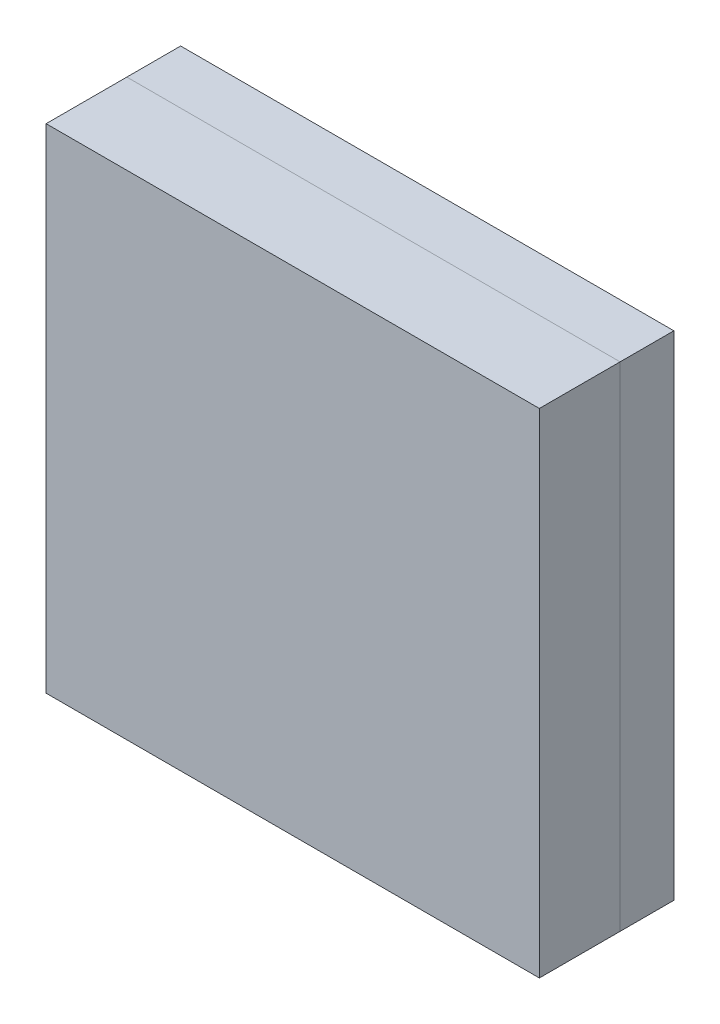
ISO-10303-21;
HEADER;
FILE_DESCRIPTION(('STEP AP214'),'2;1');
FILE_NAME('part.step','',(''),(''),'','','');
FILE_SCHEMA(('AUTOMOTIVE_DESIGN { 1 0 10303 214 1 1 1 1 }'));
ENDSEC;
DATA;
#1=APPLICATION_CONTEXT('core data for automotive mechanical design processes');
#2=APPLICATION_PROTOCOL_DEFINITION('international standard','automotive_design',2000,#1);
#3=PRODUCT_CONTEXT('',#1,'mechanical');
#4=PRODUCT('Part','Part','',(#3));
#5=PRODUCT_RELATED_PRODUCT_CATEGORY('part','',(#4));
#6=PRODUCT_DEFINITION_FORMATION('','',#4);
#7=PRODUCT_DEFINITION_CONTEXT('part definition',#1,'design');
#8=PRODUCT_DEFINITION('design','',#6,#7);
#9=PRODUCT_DEFINITION_SHAPE('','',#8);
#10=(LENGTH_UNIT() NAMED_UNIT(*) SI_UNIT(.MILLI.,.METRE.));
#11=(NAMED_UNIT(*) PLANE_ANGLE_UNIT() SI_UNIT($,.RADIAN.));
#12=(NAMED_UNIT(*) SI_UNIT($,.STERADIAN.) SOLID_ANGLE_UNIT());
#13=UNCERTAINTY_MEASURE_WITH_UNIT(LENGTH_MEASURE(1.E-05),#10,'distance_accuracy_value','');
#14=(GEOMETRIC_REPRESENTATION_CONTEXT(3) GLOBAL_UNCERTAINTY_ASSIGNED_CONTEXT((#13)) GLOBAL_UNIT_ASSIGNED_CONTEXT((#10,
#11,#12)) REPRESENTATION_CONTEXT('',''));
#15=CARTESIAN_POINT('',(0.,0.,0.));
#16=DIRECTION('',(0.,0.,1.));
#17=DIRECTION('',(1.,0.,0.));
#18=AXIS2_PLACEMENT_3D('',#15,#16,#17);
#19=CARTESIAN_POINT('',(5.5,5.5,-0.6));
#20=DIRECTION('',(-1.,0.,0.));
#21=DIRECTION('',(0.,0.,1.));
#22=AXIS2_PLACEMENT_3D('',#19,#20,#21);
#23=PLANE('',#22);
#24=DIRECTION('',(0.,-1.,0.));
#25=VECTOR('',#24,1.);
#26=CARTESIAN_POINT('',(5.5,5.5,0.));
#27=LINE('',#26,#25);
#28=CARTESIAN_POINT('',(5.5,5.5,0.));
#29=VERTEX_POINT('',#28);
#30=CARTESIAN_POINT('',(5.5,0.,0.));
#31=VERTEX_POINT('',#30);
#32=EDGE_CURVE('E139',#29,#31,#27,.T.);
#33=ORIENTED_EDGE('',*,*,#32,.T.);
#34=DIRECTION('',(0.,0.,1.));
#35=VECTOR('',#34,1.);
#36=CARTESIAN_POINT('',(5.5,0.,-0.6));
#37=LINE('',#36,#35);
#38=CARTESIAN_POINT('',(5.5,0.,-0.6));
#39=VERTEX_POINT('',#38);
#40=EDGE_CURVE('E13',#39,#31,#37,.T.);
#41=ORIENTED_EDGE('',*,*,#40,.F.);
#42=DIRECTION('',(0.,-1.,0.));
#43=VECTOR('',#42,1.);
#44=CARTESIAN_POINT('',(5.5,5.5,-0.6));
#45=LINE('',#44,#43);
#46=CARTESIAN_POINT('',(5.5,5.5,-0.6));
#47=VERTEX_POINT('',#46);
#48=EDGE_CURVE('E127',#47,#39,#45,.T.);
#49=ORIENTED_EDGE('',*,*,#48,.F.);
#50=DIRECTION('',(0.,0.,1.));
#51=VECTOR('',#50,1.);
#52=CARTESIAN_POINT('',(5.5,5.5,-0.6));
#53=LINE('',#52,#51);
#54=EDGE_CURVE('E135',#47,#29,#53,.T.);
#55=ORIENTED_EDGE('',*,*,#54,.T.);
#56=EDGE_LOOP('',(#33,#41,#49,#55));
#57=FACE_BOUND('',#56,.T.);
#58=ADVANCED_FACE('F76',(#57),#23,.F.);
#59=CARTESIAN_POINT('',(5.5,0.,-0.6));
#60=DIRECTION('',(0.,1.,0.));
#61=DIRECTION('',(0.,0.,1.));
#62=AXIS2_PLACEMENT_3D('',#59,#60,#61);
#63=PLANE('',#62);
#64=DIRECTION('',(-1.,0.,0.));
#65=VECTOR('',#64,1.);
#66=CARTESIAN_POINT('',(5.5,0.,0.));
#67=LINE('',#66,#65);
#68=CARTESIAN_POINT('',(0.,0.,0.));
#69=VERTEX_POINT('',#68);
#70=EDGE_CURVE('E131',#31,#69,#67,.T.);
#71=ORIENTED_EDGE('',*,*,#70,.T.);
#72=DIRECTION('',(0.,0.,1.));
#73=VECTOR('',#72,1.);
#74=CARTESIAN_POINT('',(0.,0.,-0.6));
#75=LINE('',#74,#73);
#76=CARTESIAN_POINT('',(0.,0.,-0.6));
#77=VERTEX_POINT('',#76);
#78=EDGE_CURVE('E84',#77,#69,#75,.T.);
#79=ORIENTED_EDGE('',*,*,#78,.F.);
#80=DIRECTION('',(-1.,0.,0.));
#81=VECTOR('',#80,1.);
#82=CARTESIAN_POINT('',(5.5,0.,-0.6));
#83=LINE('',#82,#81);
#84=EDGE_CURVE('E122',#39,#77,#83,.T.);
#85=ORIENTED_EDGE('',*,*,#84,.F.);
#86=ORIENTED_EDGE('',*,*,#40,.T.);
#87=EDGE_LOOP('',(#71,#79,#85,#86));
#88=FACE_BOUND('',#87,.T.);
#89=ADVANCED_FACE('F130',(#88),#63,.F.);
#90=CARTESIAN_POINT('',(0.,5.5,-0.6));
#91=DIRECTION('',(1.,0.,0.));
#92=DIRECTION('',(0.,0.,-1.));
#93=AXIS2_PLACEMENT_3D('',#90,#91,#92);
#94=PLANE('',#93);
#95=DIRECTION('',(0.,1.,0.));
#96=VECTOR('',#95,1.);
#97=CARTESIAN_POINT('',(0.,5.5,0.));
#98=LINE('',#97,#96);
#99=CARTESIAN_POINT('',(0.,5.5,0.));
#100=VERTEX_POINT('',#99);
#101=EDGE_CURVE('E109',#69,#100,#98,.T.);
#102=ORIENTED_EDGE('',*,*,#101,.T.);
#103=DIRECTION('',(0.,0.,1.));
#104=VECTOR('',#103,1.);
#105=CARTESIAN_POINT('',(0.,5.5,-0.6));
#106=LINE('',#105,#104);
#107=CARTESIAN_POINT('',(0.,5.5,-0.6));
#108=VERTEX_POINT('',#107);
#109=EDGE_CURVE('E132',#108,#100,#106,.T.);
#110=ORIENTED_EDGE('',*,*,#109,.F.);
#111=DIRECTION('',(0.,1.,0.));
#112=VECTOR('',#111,1.);
#113=CARTESIAN_POINT('',(0.,5.5,-0.6));
#114=LINE('',#113,#112);
#115=EDGE_CURVE('E125',#77,#108,#114,.T.);
#116=ORIENTED_EDGE('',*,*,#115,.F.);
#117=ORIENTED_EDGE('',*,*,#78,.T.);
#118=EDGE_LOOP('',(#102,#110,#116,#117));
#119=FACE_BOUND('',#118,.T.);
#120=ADVANCED_FACE('F133',(#119),#94,.F.);
#121=CARTESIAN_POINT('',(5.5,5.5,-0.6));
#122=DIRECTION('',(0.,-1.,0.));
#123=DIRECTION('',(0.,0.,-1.));
#124=AXIS2_PLACEMENT_3D('',#121,#122,#123);
#125=PLANE('',#124);
#126=DIRECTION('',(1.,0.,0.));
#127=VECTOR('',#126,1.);
#128=CARTESIAN_POINT('',(5.5,5.5,0.));
#129=LINE('',#128,#127);
#130=EDGE_CURVE('E115',#100,#29,#129,.T.);
#131=ORIENTED_EDGE('',*,*,#130,.T.);
#132=ORIENTED_EDGE('',*,*,#54,.F.);
#133=DIRECTION('',(1.,0.,0.));
#134=VECTOR('',#133,1.);
#135=CARTESIAN_POINT('',(5.5,5.5,-0.6));
#136=LINE('',#135,#134);
#137=EDGE_CURVE('E92',#108,#47,#136,.T.);
#138=ORIENTED_EDGE('',*,*,#137,.F.);
#139=ORIENTED_EDGE('',*,*,#109,.T.);
#140=EDGE_LOOP('',(#131,#132,#138,#139));
#141=FACE_BOUND('',#140,.T.);
#142=ADVANCED_FACE('F146',(#141),#125,.F.);
#143=CARTESIAN_POINT('',(0.,0.,-0.6));
#144=DIRECTION('',(0.,0.,-1.));
#145=DIRECTION('',(-1.,0.,0.));
#146=AXIS2_PLACEMENT_3D('',#143,#144,#145);
#147=PLANE('',#146);
#148=ORIENTED_EDGE('',*,*,#48,.T.);
#149=ORIENTED_EDGE('',*,*,#84,.T.);
#150=ORIENTED_EDGE('',*,*,#115,.T.);
#151=ORIENTED_EDGE('',*,*,#137,.T.);
#152=EDGE_LOOP('',(#148,#149,#150,#151));
#153=FACE_BOUND('',#152,.T.);
#154=ADVANCED_FACE('F123',(#153),#147,.T.);
#155=CARTESIAN_POINT('',(0.,0.,0.));
#156=DIRECTION('',(0.,0.,-1.));
#157=DIRECTION('',(-1.,0.,0.));
#158=AXIS2_PLACEMENT_3D('',#155,#156,#157);
#159=PLANE('',#158);
#160=ORIENTED_EDGE('',*,*,#32,.F.);
#161=ORIENTED_EDGE('',*,*,#130,.F.);
#162=ORIENTED_EDGE('',*,*,#101,.F.);
#163=ORIENTED_EDGE('',*,*,#70,.F.);
#164=EDGE_LOOP('',(#160,#161,#162,#163));
#165=FACE_BOUND('',#164,.T.);
#166=ADVANCED_FACE('F149',(#165),#159,.F.);
#167=CLOSED_SHELL('',(#58,#89,#120,#142,#154,#166));
#168=MANIFOLD_SOLID_BREP('B2',#167);
#169=CARTESIAN_POINT('',(0.499999999999998,5.,0.8));
#170=DIRECTION('',(1.,0.,0.));
#171=DIRECTION('',(0.,1.,0.));
#172=AXIS2_PLACEMENT_3D('',#169,#170,#171);
#173=PLANE('',#172);
#174=DIRECTION('',(0.,0.,-1.));
#175=VECTOR('',#174,1.);
#176=CARTESIAN_POINT('',(0.499999999999998,5.,0.8));
#177=LINE('',#176,#175);
#178=CARTESIAN_POINT('',(0.499999999999998,5.,0.1));
#179=VERTEX_POINT('',#178);
#180=CARTESIAN_POINT('',(0.499999999999998,5.,0.));
#181=VERTEX_POINT('',#180);
#182=EDGE_CURVE('E647',#179,#181,#177,.T.);
#183=ORIENTED_EDGE('',*,*,#182,.F.);
#184=DIRECTION('',(0.,-1.,0.));
#185=VECTOR('',#184,1.);
#186=CARTESIAN_POINT('',(0.499999999999998,5.,0.1));
#187=LINE('',#186,#185);
#188=CARTESIAN_POINT('',(0.499999999999999,3.5,0.1));
#189=VERTEX_POINT('',#188);
#190=EDGE_CURVE('E666',#179,#189,#187,.T.);
#191=ORIENTED_EDGE('',*,*,#190,.T.);
#192=DIRECTION('',(0.,0.,-1.));
#193=VECTOR('',#192,1.);
#194=CARTESIAN_POINT('',(0.499999999999999,3.5,5.44341649025257));
#195=LINE('',#194,#193);
#196=CARTESIAN_POINT('',(0.499999999999998,3.5,0.));
#197=VERTEX_POINT('',#196);
#198=EDGE_CURVE('E584',#189,#197,#195,.T.);
#199=ORIENTED_EDGE('',*,*,#198,.T.);
#200=DIRECTION('',(0.,-1.,0.));
#201=VECTOR('',#200,1.);
#202=CARTESIAN_POINT('',(0.499999999999998,5.,0.));
#203=LINE('',#202,#201);
#204=EDGE_CURVE('E635',#181,#197,#203,.T.);
#205=ORIENTED_EDGE('',*,*,#204,.F.);
#206=EDGE_LOOP('',(#183,#191,#199,#205));
#207=FACE_BOUND('',#206,.T.);
#208=ADVANCED_FACE('F237',(#207),#173,.T.);
#209=CARTESIAN_POINT('',(0.499999999999999,0.5,0.8));
#210=DIRECTION('',(0.,1.,0.));
#211=DIRECTION('',(-1.,0.,0.));
#212=AXIS2_PLACEMENT_3D('',#209,#210,#211);
#213=PLANE('',#212);
#214=DIRECTION('',(0.,0.,-1.));
#215=VECTOR('',#214,1.);
#216=CARTESIAN_POINT('',(0.499999999999999,0.5,0.8));
#217=LINE('',#216,#215);
#218=CARTESIAN_POINT('',(0.499999999999999,0.5,0.100000000000001));
#219=VERTEX_POINT('',#218);
#220=CARTESIAN_POINT('',(0.499999999999999,0.5,0.));
#221=VERTEX_POINT('',#220);
#222=EDGE_CURVE('E502',#219,#221,#217,.T.);
#223=ORIENTED_EDGE('',*,*,#222,.F.);
#224=DIRECTION('',(1.,0.,0.));
#225=VECTOR('',#224,1.);
#226=CARTESIAN_POINT('',(0.,0.499999999999997,0.100000000000001));
#227=LINE('',#226,#225);
#228=CARTESIAN_POINT('',(2.,0.499999999999998,0.100000000000001));
#229=VERTEX_POINT('',#228);
#230=EDGE_CURVE('E491',#219,#229,#227,.T.);
#231=ORIENTED_EDGE('',*,*,#230,.T.);
#232=DIRECTION('',(0.,0.,-1.));
#233=VECTOR('',#232,1.);
#234=CARTESIAN_POINT('',(2.,0.5,5.44341649025257));
#235=LINE('',#234,#233);
#236=CARTESIAN_POINT('',(2.,0.5,0.));
#237=VERTEX_POINT('',#236);
#238=EDGE_CURVE('E553',#229,#237,#235,.T.);
#239=ORIENTED_EDGE('',*,*,#238,.T.);
#240=DIRECTION('',(1.,0.,0.));
#241=VECTOR('',#240,1.);
#242=CARTESIAN_POINT('',(0.499999999999999,0.5,0.));
#243=LINE('',#242,#241);
#244=EDGE_CURVE('E639',#221,#237,#243,.T.);
#245=ORIENTED_EDGE('',*,*,#244,.F.);
#246=EDGE_LOOP('',(#223,#231,#239,#245));
#247=FACE_BOUND('',#246,.T.);
#248=ADVANCED_FACE('F779',(#247),#213,.T.);
#249=CARTESIAN_POINT('',(5.,5.,0.8));
#250=DIRECTION('',(-1.,0.,0.));
#251=DIRECTION('',(0.,-1.,0.));
#252=AXIS2_PLACEMENT_3D('',#249,#250,#251);
#253=PLANE('',#252);
#254=DIRECTION('',(0.,0.,-1.));
#255=VECTOR('',#254,1.);
#256=CARTESIAN_POINT('',(5.,3.5,5.44341649025257));
#257=LINE('',#256,#255);
#258=CARTESIAN_POINT('',(5.,3.5,0.1));
#259=VERTEX_POINT('',#258);
#260=CARTESIAN_POINT('',(5.,3.5,0.));
#261=VERTEX_POINT('',#260);
#262=EDGE_CURVE('E602',#259,#261,#257,.T.);
#263=ORIENTED_EDGE('',*,*,#262,.F.);
#264=DIRECTION('',(0.,-1.,0.));
#265=VECTOR('',#264,1.);
#266=CARTESIAN_POINT('',(5.,5.,0.1));
#267=LINE('',#266,#265);
#268=CARTESIAN_POINT('',(5.,5.,0.1));
#269=VERTEX_POINT('',#268);
#270=EDGE_CURVE('E482',#269,#259,#267,.T.);
#271=ORIENTED_EDGE('',*,*,#270,.F.);
#272=DIRECTION('',(0.,0.,-1.));
#273=VECTOR('',#272,1.);
#274=CARTESIAN_POINT('',(5.,5.,0.8));
#275=LINE('',#274,#273);
#276=CARTESIAN_POINT('',(5.,5.,0.));
#277=VERTEX_POINT('',#276);
#278=EDGE_CURVE('E504',#269,#277,#275,.T.);
#279=ORIENTED_EDGE('',*,*,#278,.T.);
#280=DIRECTION('',(0.,1.,0.));
#281=VECTOR('',#280,1.);
#282=CARTESIAN_POINT('',(5.,5.,0.));
#283=LINE('',#282,#281);
#284=EDGE_CURVE('E642',#261,#277,#283,.T.);
#285=ORIENTED_EDGE('',*,*,#284,.F.);
#286=EDGE_LOOP('',(#263,#271,#279,#285));
#287=FACE_BOUND('',#286,.T.);
#288=ADVANCED_FACE('F722',(#287),#253,.T.);
#289=CARTESIAN_POINT('',(0.499999999999998,5.,0.8));
#290=DIRECTION('',(0.,-1.,0.));
#291=DIRECTION('',(0.,0.,-1.));
#292=AXIS2_PLACEMENT_3D('',#289,#290,#291);
#293=PLANE('',#292);
#294=DIRECTION('',(0.,0.,-1.));
#295=VECTOR('',#294,1.);
#296=CARTESIAN_POINT('',(2.,5.,5.44341649025257));
#297=LINE('',#296,#295);
#298=CARTESIAN_POINT('',(2.,5.,0.0999999999999994));
#299=VERTEX_POINT('',#298);
#300=CARTESIAN_POINT('',(2.,5.,0.));
#301=VERTEX_POINT('',#300);
#302=EDGE_CURVE('E695',#299,#301,#297,.T.);
#303=ORIENTED_EDGE('',*,*,#302,.F.);
#304=DIRECTION('',(1.,0.,0.));
#305=VECTOR('',#304,1.);
#306=CARTESIAN_POINT('',(0.,5.,0.1));
#307=LINE('',#306,#305);
#308=EDGE_CURVE('E253',#179,#299,#307,.T.);
#309=ORIENTED_EDGE('',*,*,#308,.F.);
#310=ORIENTED_EDGE('',*,*,#182,.T.);
#311=DIRECTION('',(-1.,0.,0.));
#312=VECTOR('',#311,1.);
#313=CARTESIAN_POINT('',(0.499999999999998,5.,0.));
#314=LINE('',#313,#312);
#315=EDGE_CURVE('E644',#301,#181,#314,.T.);
#316=ORIENTED_EDGE('',*,*,#315,.F.);
#317=EDGE_LOOP('',(#303,#309,#310,#316));
#318=FACE_BOUND('',#317,.T.);
#319=ADVANCED_FACE('F655',(#318),#293,.T.);
#320=DIRECTION('',(0.,0.,-1.));
#321=VECTOR('',#320,1.);
#322=CARTESIAN_POINT('',(0.499999999999999,2.,5.44341649025257));
#323=LINE('',#322,#321);
#324=CARTESIAN_POINT('',(0.499999999999999,2.,0.1));
#325=VERTEX_POINT('',#324);
#326=CARTESIAN_POINT('',(0.499999999999999,2.,0.));
#327=VERTEX_POINT('',#326);
#328=EDGE_CURVE('E598',#325,#327,#323,.T.);
#329=ORIENTED_EDGE('',*,*,#328,.F.);
#330=DIRECTION('',(0.,-1.,0.));
#331=VECTOR('',#330,1.);
#332=CARTESIAN_POINT('',(0.499999999999998,5.,0.1));
#333=LINE('',#332,#331);
#334=EDGE_CURVE('E261',#325,#219,#333,.T.);
#335=ORIENTED_EDGE('',*,*,#334,.T.);
#336=ORIENTED_EDGE('',*,*,#222,.T.);
#337=EDGE_CURVE('E634',#327,#221,#203,.T.);
#338=ORIENTED_EDGE('',*,*,#337,.F.);
#339=EDGE_LOOP('',(#329,#335,#336,#338));
#340=FACE_BOUND('',#339,.T.);
#341=ADVANCED_FACE('F781',(#340),#173,.T.);
#342=DIRECTION('',(0.,0.,-1.));
#343=VECTOR('',#342,1.);
#344=CARTESIAN_POINT('',(3.5,0.5,5.44341649025257));
#345=LINE('',#344,#343);
#346=CARTESIAN_POINT('',(3.5,0.5,0.1));
#347=VERTEX_POINT('',#346);
#348=CARTESIAN_POINT('',(3.5,0.499999999999999,0.));
#349=VERTEX_POINT('',#348);
#350=EDGE_CURVE('E490',#347,#349,#345,.T.);
#351=ORIENTED_EDGE('',*,*,#350,.F.);
#352=CARTESIAN_POINT('',(5.,0.499999999999999,0.100000000000001));
#353=VERTEX_POINT('',#352);
#354=EDGE_CURVE('E475',#347,#353,#227,.T.);
#355=ORIENTED_EDGE('',*,*,#354,.T.);
#356=DIRECTION('',(0.,0.,-1.));
#357=VECTOR('',#356,1.);
#358=CARTESIAN_POINT('',(5.,0.499999999999999,0.8));
#359=LINE('',#358,#357);
#360=CARTESIAN_POINT('',(5.,0.499999999999999,0.));
#361=VERTEX_POINT('',#360);
#362=EDGE_CURVE('E488',#353,#361,#359,.T.);
#363=ORIENTED_EDGE('',*,*,#362,.T.);
#364=EDGE_CURVE('E638',#349,#361,#243,.T.);
#365=ORIENTED_EDGE('',*,*,#364,.F.);
#366=EDGE_LOOP('',(#351,#355,#363,#365));
#367=FACE_BOUND('',#366,.T.);
#368=ADVANCED_FACE('F486',(#367),#213,.T.);
#369=ORIENTED_EDGE('',*,*,#362,.F.);
#370=CARTESIAN_POINT('',(5.,2.,0.1));
#371=VERTEX_POINT('',#370);
#372=EDGE_CURVE('E472',#371,#353,#267,.T.);
#373=ORIENTED_EDGE('',*,*,#372,.F.);
#374=DIRECTION('',(0.,0.,-1.));
#375=VECTOR('',#374,1.);
#376=CARTESIAN_POINT('',(5.,2.,5.44341649025257));
#377=LINE('',#376,#375);
#378=CARTESIAN_POINT('',(5.,2.,0.));
#379=VERTEX_POINT('',#378);
#380=EDGE_CURVE('E603',#371,#379,#377,.T.);
#381=ORIENTED_EDGE('',*,*,#380,.T.);
#382=EDGE_CURVE('E497',#361,#379,#283,.T.);
#383=ORIENTED_EDGE('',*,*,#382,.F.);
#384=EDGE_LOOP('',(#369,#373,#381,#383));
#385=FACE_BOUND('',#384,.T.);
#386=ADVANCED_FACE('F495',(#385),#253,.T.);
#387=ORIENTED_EDGE('',*,*,#278,.F.);
#388=CARTESIAN_POINT('',(3.5,5.,0.1));
#389=VERTEX_POINT('',#388);
#390=EDGE_CURVE('E705',#389,#269,#307,.T.);
#391=ORIENTED_EDGE('',*,*,#390,.F.);
#392=DIRECTION('',(0.,0.,-1.));
#393=VECTOR('',#392,1.);
#394=CARTESIAN_POINT('',(3.5,5.,5.44341649025257));
#395=LINE('',#394,#393);
#396=CARTESIAN_POINT('',(3.5,5.,0.));
#397=VERTEX_POINT('',#396);
#398=EDGE_CURVE('E565',#389,#397,#395,.T.);
#399=ORIENTED_EDGE('',*,*,#398,.T.);
#400=EDGE_CURVE('E645',#277,#397,#314,.T.);
#401=ORIENTED_EDGE('',*,*,#400,.F.);
#402=EDGE_LOOP('',(#387,#391,#399,#401));
#403=FACE_BOUND('',#402,.T.);
#404=ADVANCED_FACE('F704',(#403),#293,.T.);
#405=CARTESIAN_POINT('',(5.,2.,5.44341649025257));
#406=DIRECTION('',(0.,-1.,0.));
#407=DIRECTION('',(1.,0.,0.));
#408=AXIS2_PLACEMENT_3D('',#405,#406,#407);
#409=PLANE('',#408);
#410=DIRECTION('',(0.,0.,1.));
#411=VECTOR('',#410,1.);
#412=CARTESIAN_POINT('',(2.,2.,5.44341649025257));
#413=LINE('',#412,#411);
#414=CARTESIAN_POINT('',(2.,2.,0.));
#415=VERTEX_POINT('',#414);
#416=CARTESIAN_POINT('',(2.,2.,0.100000000000001));
#417=VERTEX_POINT('',#416);
#418=EDGE_CURVE('E569',#415,#417,#413,.T.);
#419=ORIENTED_EDGE('',*,*,#418,.T.);
#420=DIRECTION('',(-1.,0.,0.));
#421=VECTOR('',#420,1.);
#422=CARTESIAN_POINT('',(5.,2.,0.1));
#423=LINE('',#422,#421);
#424=EDGE_CURVE('E759',#417,#325,#423,.T.);
#425=ORIENTED_EDGE('',*,*,#424,.T.);
#426=ORIENTED_EDGE('',*,*,#328,.T.);
#427=DIRECTION('',(-1.,0.,0.));
#428=VECTOR('',#427,1.);
#429=CARTESIAN_POINT('',(5.,2.,0.));
#430=LINE('',#429,#428);
#431=EDGE_CURVE('E590',#415,#327,#430,.T.);
#432=ORIENTED_EDGE('',*,*,#431,.F.);
#433=EDGE_LOOP('',(#419,#425,#426,#432));
#434=FACE_BOUND('',#433,.T.);
#435=ADVANCED_FACE('F1008',(#434),#409,.T.);
#436=CARTESIAN_POINT('',(5.,3.5,5.44341649025257));
#437=DIRECTION('',(0.,-1.,0.));
#438=DIRECTION('',(1.,0.,0.));
#439=AXIS2_PLACEMENT_3D('',#436,#437,#438);
#440=PLANE('',#439);
#441=DIRECTION('',(-1.,0.,0.));
#442=VECTOR('',#441,1.);
#443=CARTESIAN_POINT('',(5.,3.5,0.1));
#444=LINE('',#443,#442);
#445=CARTESIAN_POINT('',(2.,3.5,0.1));
#446=VERTEX_POINT('',#445);
#447=EDGE_CURVE('E672',#446,#189,#444,.T.);
#448=ORIENTED_EDGE('',*,*,#447,.F.);
#449=DIRECTION('',(0.,0.,1.));
#450=VECTOR('',#449,1.);
#451=CARTESIAN_POINT('',(2.,3.5,5.44341649025257));
#452=LINE('',#451,#450);
#453=CARTESIAN_POINT('',(2.,3.5,0.));
#454=VERTEX_POINT('',#453);
#455=EDGE_CURVE('E566',#454,#446,#452,.T.);
#456=ORIENTED_EDGE('',*,*,#455,.F.);
#457=DIRECTION('',(-1.,0.,0.));
#458=VECTOR('',#457,1.);
#459=CARTESIAN_POINT('',(5.,3.5,0.));
#460=LINE('',#459,#458);
#461=EDGE_CURVE('E585',#454,#197,#460,.T.);
#462=ORIENTED_EDGE('',*,*,#461,.T.);
#463=ORIENTED_EDGE('',*,*,#198,.F.);
#464=EDGE_LOOP('',(#448,#456,#462,#463));
#465=FACE_BOUND('',#464,.T.);
#466=ADVANCED_FACE('F670',(#465),#440,.F.);
#467=ORIENTED_EDGE('',*,*,#380,.F.);
#468=DIRECTION('',(-1.,0.,0.));
#469=VECTOR('',#468,1.);
#470=CARTESIAN_POINT('',(5.,2.,0.1));
#471=LINE('',#470,#469);
#472=CARTESIAN_POINT('',(3.5,2.,0.100000000000001));
#473=VERTEX_POINT('',#472);
#474=EDGE_CURVE('E478',#371,#473,#471,.T.);
#475=ORIENTED_EDGE('',*,*,#474,.T.);
#476=DIRECTION('',(0.,0.,1.));
#477=VECTOR('',#476,1.);
#478=CARTESIAN_POINT('',(3.5,2.,5.44341649025257));
#479=LINE('',#478,#477);
#480=CARTESIAN_POINT('',(3.5,2.,0.));
#481=VERTEX_POINT('',#480);
#482=EDGE_CURVE('E577',#481,#473,#479,.T.);
#483=ORIENTED_EDGE('',*,*,#482,.F.);
#484=EDGE_CURVE('E586',#379,#481,#430,.T.);
#485=ORIENTED_EDGE('',*,*,#484,.F.);
#486=EDGE_LOOP('',(#467,#475,#483,#485));
#487=FACE_BOUND('',#486,.T.);
#488=ADVANCED_FACE('F805',(#487),#409,.T.);
#489=DIRECTION('',(-1.,0.,0.));
#490=VECTOR('',#489,1.);
#491=CARTESIAN_POINT('',(5.,3.5,0.1));
#492=LINE('',#491,#490);
#493=CARTESIAN_POINT('',(3.5,3.5,0.1));
#494=VERTEX_POINT('',#493);
#495=EDGE_CURVE('E680',#259,#494,#492,.T.);
#496=ORIENTED_EDGE('',*,*,#495,.F.);
#497=ORIENTED_EDGE('',*,*,#262,.T.);
#498=CARTESIAN_POINT('',(3.5,3.5,0.));
#499=VERTEX_POINT('',#498);
#500=EDGE_CURVE('E581',#261,#499,#460,.T.);
#501=ORIENTED_EDGE('',*,*,#500,.T.);
#502=DIRECTION('',(0.,0.,1.));
#503=VECTOR('',#502,1.);
#504=CARTESIAN_POINT('',(3.5,3.5,5.44341649025257));
#505=LINE('',#504,#503);
#506=EDGE_CURVE('E573',#499,#494,#505,.T.);
#507=ORIENTED_EDGE('',*,*,#506,.T.);
#508=EDGE_LOOP('',(#496,#497,#501,#507));
#509=FACE_BOUND('',#508,.T.);
#510=ADVANCED_FACE('F718',(#509),#440,.F.);
#511=CARTESIAN_POINT('',(2.,5.,5.44341649025257));
#512=DIRECTION('',(1.,0.,0.));
#513=DIRECTION('',(0.,1.,0.));
#514=AXIS2_PLACEMENT_3D('',#511,#512,#513);
#515=PLANE('',#514);
#516=DIRECTION('',(0.,-1.,0.));
#517=VECTOR('',#516,1.);
#518=CARTESIAN_POINT('',(2.,5.,0.1));
#519=LINE('',#518,#517);
#520=EDGE_CURVE('E676',#299,#446,#519,.T.);
#521=ORIENTED_EDGE('',*,*,#520,.F.);
#522=ORIENTED_EDGE('',*,*,#302,.T.);
#523=DIRECTION('',(0.,-1.,0.));
#524=VECTOR('',#523,1.);
#525=CARTESIAN_POINT('',(2.,5.,0.));
#526=LINE('',#525,#524);
#527=EDGE_CURVE('E558',#301,#454,#526,.T.);
#528=ORIENTED_EDGE('',*,*,#527,.T.);
#529=ORIENTED_EDGE('',*,*,#455,.T.);
#530=EDGE_LOOP('',(#521,#522,#528,#529));
#531=FACE_BOUND('',#530,.T.);
#532=ADVANCED_FACE('F824',(#531),#515,.F.);
#533=CARTESIAN_POINT('',(3.5,5.,5.44341649025257));
#534=DIRECTION('',(1.,0.,0.));
#535=DIRECTION('',(0.,1.,0.));
#536=AXIS2_PLACEMENT_3D('',#533,#534,#535);
#537=PLANE('',#536);
#538=ORIENTED_EDGE('',*,*,#398,.F.);
#539=DIRECTION('',(0.,-1.,0.));
#540=VECTOR('',#539,1.);
#541=CARTESIAN_POINT('',(3.5,5.,0.1));
#542=LINE('',#541,#540);
#543=EDGE_CURVE('E715',#389,#494,#542,.T.);
#544=ORIENTED_EDGE('',*,*,#543,.T.);
#545=ORIENTED_EDGE('',*,*,#506,.F.);
#546=DIRECTION('',(0.,-1.,0.));
#547=VECTOR('',#546,1.);
#548=CARTESIAN_POINT('',(3.5,5.,0.));
#549=LINE('',#548,#547);
#550=EDGE_CURVE('E556',#397,#499,#549,.T.);
#551=ORIENTED_EDGE('',*,*,#550,.F.);
#552=EDGE_LOOP('',(#538,#544,#545,#551));
#553=FACE_BOUND('',#552,.T.);
#554=ADVANCED_FACE('F714',(#553),#537,.T.);
#555=ORIENTED_EDGE('',*,*,#482,.T.);
#556=DIRECTION('',(0.,-1.,0.));
#557=VECTOR('',#556,1.);
#558=CARTESIAN_POINT('',(3.5,5.,0.1));
#559=LINE('',#558,#557);
#560=EDGE_CURVE('E762',#473,#347,#559,.T.);
#561=ORIENTED_EDGE('',*,*,#560,.T.);
#562=ORIENTED_EDGE('',*,*,#350,.T.);
#563=EDGE_CURVE('E552',#481,#349,#549,.T.);
#564=ORIENTED_EDGE('',*,*,#563,.F.);
#565=EDGE_LOOP('',(#555,#561,#562,#564));
#566=FACE_BOUND('',#565,.T.);
#567=ADVANCED_FACE('F1067',(#566),#537,.T.);
#568=DIRECTION('',(0.,-1.,0.));
#569=VECTOR('',#568,1.);
#570=CARTESIAN_POINT('',(2.,5.,0.1));
#571=LINE('',#570,#569);
#572=EDGE_CURVE('E74',#417,#229,#571,.T.);
#573=ORIENTED_EDGE('',*,*,#572,.F.);
#574=ORIENTED_EDGE('',*,*,#418,.F.);
#575=EDGE_CURVE('E684',#415,#237,#526,.T.);
#576=ORIENTED_EDGE('',*,*,#575,.T.);
#577=ORIENTED_EDGE('',*,*,#238,.F.);
#578=EDGE_LOOP('',(#573,#574,#576,#577));
#579=FACE_BOUND('',#578,.T.);
#580=ADVANCED_FACE('F1058',(#579),#515,.F.);
#581=CARTESIAN_POINT('',(0.,0.,0.8));
#582=DIRECTION('',(1.,0.,0.));
#583=DIRECTION('',(0.,1.,0.));
#584=AXIS2_PLACEMENT_3D('',#581,#582,#583);
#585=PLANE('',#584);
#586=DIRECTION('',(0.,0.,-1.));
#587=VECTOR('',#586,1.);
#588=CARTESIAN_POINT('',(0.,0.,0.8));
#589=LINE('',#588,#587);
#590=CARTESIAN_POINT('',(0.,0.,0.9));
#591=VERTEX_POINT('',#590);
#592=CARTESIAN_POINT('',(0.,0.,0.));
#593=VERTEX_POINT('',#592);
#594=EDGE_CURVE('E529',#591,#593,#589,.T.);
#595=ORIENTED_EDGE('',*,*,#594,.F.);
#596=DIRECTION('',(0.,-1.,0.));
#597=VECTOR('',#596,1.);
#598=CARTESIAN_POINT('',(0.,5.5,0.9));
#599=LINE('',#598,#597);
#600=CARTESIAN_POINT('',(0.,5.5,0.9));
#601=VERTEX_POINT('',#600);
#602=EDGE_CURVE('E594',#601,#591,#599,.T.);
#603=ORIENTED_EDGE('',*,*,#602,.F.);
#604=DIRECTION('',(0.,0.,-1.));
#605=VECTOR('',#604,1.);
#606=CARTESIAN_POINT('',(0.,5.5,0.8));
#607=LINE('',#606,#605);
#608=CARTESIAN_POINT('',(0.,5.5,0.));
#609=VERTEX_POINT('',#608);
#610=EDGE_CURVE('E523',#601,#609,#607,.T.);
#611=ORIENTED_EDGE('',*,*,#610,.T.);
#612=DIRECTION('',(0.,-1.,0.));
#613=VECTOR('',#612,1.);
#614=CARTESIAN_POINT('',(0.,0.,0.));
#615=LINE('',#614,#613);
#616=EDGE_CURVE('E511',#609,#593,#615,.T.);
#617=ORIENTED_EDGE('',*,*,#616,.T.);
#618=EDGE_LOOP('',(#595,#603,#611,#617));
#619=FACE_BOUND('',#618,.T.);
#620=ADVANCED_FACE('F239',(#619),#585,.F.);
#621=CARTESIAN_POINT('',(0.,0.,0.8));
#622=DIRECTION('',(0.,1.,0.));
#623=DIRECTION('',(0.,0.,1.));
#624=AXIS2_PLACEMENT_3D('',#621,#622,#623);
#625=PLANE('',#624);
#626=DIRECTION('',(0.,0.,-1.));
#627=VECTOR('',#626,1.);
#628=CARTESIAN_POINT('',(5.5,0.,0.8));
#629=LINE('',#628,#627);
#630=CARTESIAN_POINT('',(5.5,0.,0.9));
#631=VERTEX_POINT('',#630);
#632=CARTESIAN_POINT('',(5.5,0.,0.));
#633=VERTEX_POINT('',#632);
#634=EDGE_CURVE('E527',#631,#633,#629,.T.);
#635=ORIENTED_EDGE('',*,*,#634,.F.);
#636=DIRECTION('',(1.,0.,0.));
#637=VECTOR('',#636,1.);
#638=CARTESIAN_POINT('',(0.,0.,0.9));
#639=LINE('',#638,#637);
#640=EDGE_CURVE('E615',#591,#631,#639,.T.);
#641=ORIENTED_EDGE('',*,*,#640,.F.);
#642=ORIENTED_EDGE('',*,*,#594,.T.);
#643=DIRECTION('',(1.,0.,0.));
#644=VECTOR('',#643,1.);
#645=CARTESIAN_POINT('',(0.,0.,0.));
#646=LINE('',#645,#644);
#647=EDGE_CURVE('E514',#593,#633,#646,.T.);
#648=ORIENTED_EDGE('',*,*,#647,.T.);
#649=EDGE_LOOP('',(#635,#641,#642,#648));
#650=FACE_BOUND('',#649,.T.);
#651=ADVANCED_FACE('F1247',(#650),#625,.F.);
#652=CARTESIAN_POINT('',(5.5,0.,0.8));
#653=DIRECTION('',(-1.,0.,0.));
#654=DIRECTION('',(0.,-1.,0.));
#655=AXIS2_PLACEMENT_3D('',#652,#653,#654);
#656=PLANE('',#655);
#657=DIRECTION('',(0.,0.,-1.));
#658=VECTOR('',#657,1.);
#659=CARTESIAN_POINT('',(5.5,5.5,0.8));
#660=LINE('',#659,#658);
#661=CARTESIAN_POINT('',(5.5,5.5,0.9));
#662=VERTEX_POINT('',#661);
#663=CARTESIAN_POINT('',(5.5,5.5,0.));
#664=VERTEX_POINT('',#663);
#665=EDGE_CURVE('E525',#662,#664,#660,.T.);
#666=ORIENTED_EDGE('',*,*,#665,.F.);
#667=DIRECTION('',(0.,1.,0.));
#668=VECTOR('',#667,1.);
#669=CARTESIAN_POINT('',(5.5,5.5,0.9));
#670=LINE('',#669,#668);
#671=EDGE_CURVE('E618',#631,#662,#670,.T.);
#672=ORIENTED_EDGE('',*,*,#671,.F.);
#673=ORIENTED_EDGE('',*,*,#634,.T.);
#674=DIRECTION('',(0.,1.,0.));
#675=VECTOR('',#674,1.);
#676=CARTESIAN_POINT('',(5.5,0.,0.));
#677=LINE('',#676,#675);
#678=EDGE_CURVE('E517',#633,#664,#677,.T.);
#679=ORIENTED_EDGE('',*,*,#678,.T.);
#680=EDGE_LOOP('',(#666,#672,#673,#679));
#681=FACE_BOUND('',#680,.T.);
#682=ADVANCED_FACE('F1232',(#681),#656,.F.);
#683=CARTESIAN_POINT('',(0.,5.5,0.8));
#684=DIRECTION('',(0.,-1.,0.));
#685=DIRECTION('',(0.,0.,-1.));
#686=AXIS2_PLACEMENT_3D('',#683,#684,#685);
#687=PLANE('',#686);
#688=ORIENTED_EDGE('',*,*,#610,.F.);
#689=DIRECTION('',(-1.,0.,0.));
#690=VECTOR('',#689,1.);
#691=CARTESIAN_POINT('',(0.,5.5,0.9));
#692=LINE('',#691,#690);
#693=EDGE_CURVE('E621',#662,#601,#692,.T.);
#694=ORIENTED_EDGE('',*,*,#693,.F.);
#695=ORIENTED_EDGE('',*,*,#665,.T.);
#696=DIRECTION('',(-1.,0.,0.));
#697=VECTOR('',#696,1.);
#698=CARTESIAN_POINT('',(0.,5.5,0.));
#699=LINE('',#698,#697);
#700=EDGE_CURVE('E520',#664,#609,#699,.T.);
#701=ORIENTED_EDGE('',*,*,#700,.T.);
#702=EDGE_LOOP('',(#688,#694,#695,#701));
#703=FACE_BOUND('',#702,.T.);
#704=ADVANCED_FACE('F1164',(#703),#687,.F.);
#705=CARTESIAN_POINT('',(0.,0.,0.));
#706=DIRECTION('',(0.,0.,-1.));
#707=DIRECTION('',(-1.,0.,0.));
#708=AXIS2_PLACEMENT_3D('',#705,#706,#707);
#709=PLANE('',#708);
#710=ORIENTED_EDGE('',*,*,#500,.F.);
#711=ORIENTED_EDGE('',*,*,#284,.T.);
#712=ORIENTED_EDGE('',*,*,#400,.T.);
#713=ORIENTED_EDGE('',*,*,#550,.T.);
#714=EDGE_LOOP('',(#710,#711,#712,#713));
#715=FACE_BOUND('',#714,.T.);
#716=ORIENTED_EDGE('',*,*,#431,.T.);
#717=ORIENTED_EDGE('',*,*,#337,.T.);
#718=ORIENTED_EDGE('',*,*,#244,.T.);
#719=ORIENTED_EDGE('',*,*,#575,.F.);
#720=EDGE_LOOP('',(#716,#717,#718,#719));
#721=FACE_BOUND('',#720,.T.);
#722=ORIENTED_EDGE('',*,*,#527,.F.);
#723=ORIENTED_EDGE('',*,*,#315,.T.);
#724=ORIENTED_EDGE('',*,*,#204,.T.);
#725=ORIENTED_EDGE('',*,*,#461,.F.);
#726=EDGE_LOOP('',(#722,#723,#724,#725));
#727=FACE_BOUND('',#726,.T.);
#728=ORIENTED_EDGE('',*,*,#616,.F.);
#729=ORIENTED_EDGE('',*,*,#700,.F.);
#730=ORIENTED_EDGE('',*,*,#678,.F.);
#731=ORIENTED_EDGE('',*,*,#647,.F.);
#732=EDGE_LOOP('',(#728,#729,#730,#731));
#733=FACE_BOUND('',#732,.T.);
#734=ORIENTED_EDGE('',*,*,#382,.T.);
#735=ORIENTED_EDGE('',*,*,#484,.T.);
#736=ORIENTED_EDGE('',*,*,#563,.T.);
#737=ORIENTED_EDGE('',*,*,#364,.T.);
#738=EDGE_LOOP('',(#734,#735,#736,#737));
#739=FACE_BOUND('',#738,.T.);
#740=ADVANCED_FACE('F661',(#715,#721,#727,#733,#739),#709,.T.);
#741=CARTESIAN_POINT('',(0.,0.,0.9));
#742=DIRECTION('',(0.,0.,1.));
#743=DIRECTION('',(1.,0.,0.));
#744=AXIS2_PLACEMENT_3D('',#741,#742,#743);
#745=PLANE('',#744);
#746=ORIENTED_EDGE('',*,*,#602,.T.);
#747=ORIENTED_EDGE('',*,*,#640,.T.);
#748=ORIENTED_EDGE('',*,*,#671,.T.);
#749=ORIENTED_EDGE('',*,*,#693,.T.);
#750=EDGE_LOOP('',(#746,#747,#748,#749));
#751=FACE_BOUND('',#750,.T.);
#752=ADVANCED_FACE('F776',(#751),#745,.T.);
#753=CARTESIAN_POINT('',(0.,5.,0.1));
#754=DIRECTION('',(0.,0.,1.));
#755=DIRECTION('',(0.,-1.,0.));
#756=AXIS2_PLACEMENT_3D('',#753,#754,#755);
#757=PLANE('',#756);
#758=ORIENTED_EDGE('',*,*,#334,.F.);
#759=ORIENTED_EDGE('',*,*,#424,.F.);
#760=ORIENTED_EDGE('',*,*,#572,.T.);
#761=ORIENTED_EDGE('',*,*,#230,.F.);
#762=EDGE_LOOP('',(#758,#759,#760,#761));
#763=FACE_BOUND('',#762,.T.);
#764=ADVANCED_FACE('F768',(#763),#757,.F.);
#765=ORIENTED_EDGE('',*,*,#474,.F.);
#766=ORIENTED_EDGE('',*,*,#372,.T.);
#767=ORIENTED_EDGE('',*,*,#354,.F.);
#768=ORIENTED_EDGE('',*,*,#560,.F.);
#769=EDGE_LOOP('',(#765,#766,#767,#768));
#770=FACE_BOUND('',#769,.T.);
#771=ADVANCED_FACE('F474',(#770),#757,.F.);
#772=ORIENTED_EDGE('',*,*,#270,.T.);
#773=ORIENTED_EDGE('',*,*,#495,.T.);
#774=ORIENTED_EDGE('',*,*,#543,.F.);
#775=ORIENTED_EDGE('',*,*,#390,.T.);
#776=EDGE_LOOP('',(#772,#773,#774,#775));
#777=FACE_BOUND('',#776,.T.);
#778=ADVANCED_FACE('F765',(#777),#757,.F.);
#779=ORIENTED_EDGE('',*,*,#190,.F.);
#780=ORIENTED_EDGE('',*,*,#308,.T.);
#781=ORIENTED_EDGE('',*,*,#520,.T.);
#782=ORIENTED_EDGE('',*,*,#447,.T.);
#783=EDGE_LOOP('',(#779,#780,#781,#782));
#784=FACE_BOUND('',#783,.T.);
#785=ADVANCED_FACE('F675',(#784),#757,.F.);
#786=CLOSED_SHELL('',(#208,#248,#288,#319,#341,#368,#386,#404,#435,#466,#488,#510,#532,#554,
#567,#580,#620,#651,#682,#704,#740,#752,#764,#771,#778,#785));
#787=CARTESIAN_POINT('',(0.,0.,0.7));
#788=DIRECTION('',(0.,0.,1.));
#789=DIRECTION('',(1.,0.,0.));
#790=AXIS2_PLACEMENT_3D('',#787,#788,#789);
#791=PLANE('',#790);
#792=DIRECTION('',(-1.,0.,0.));
#793=VECTOR('',#792,1.);
#794=CARTESIAN_POINT('',(5.,3.5,0.7));
#795=LINE('',#794,#793);
#796=CARTESIAN_POINT('',(2.,3.5,0.7));
#797=VERTEX_POINT('',#796);
#798=CARTESIAN_POINT('',(0.499999999999998,3.5,0.7));
#799=VERTEX_POINT('',#798);
#800=EDGE_CURVE('E589',#797,#799,#795,.T.);
#801=ORIENTED_EDGE('',*,*,#800,.T.);
#802=DIRECTION('',(0.,-1.,0.));
#803=VECTOR('',#802,1.);
#804=CARTESIAN_POINT('',(0.499999999999998,5.,0.7));
#805=LINE('',#804,#803);
#806=CARTESIAN_POINT('',(0.499999999999998,5.,0.7));
#807=VERTEX_POINT('',#806);
#808=EDGE_CURVE('E631',#807,#799,#805,.T.);
#809=ORIENTED_EDGE('',*,*,#808,.F.);
#810=DIRECTION('',(-1.,0.,0.));
#811=VECTOR('',#810,1.);
#812=CARTESIAN_POINT('',(0.499999999999998,5.,0.7));
#813=LINE('',#812,#811);
#814=CARTESIAN_POINT('',(2.,5.,0.7));
#815=VERTEX_POINT('',#814);
#816=EDGE_CURVE('E531',#815,#807,#813,.T.);
#817=ORIENTED_EDGE('',*,*,#816,.F.);
#818=DIRECTION('',(0.,-1.,0.));
#819=VECTOR('',#818,1.);
#820=CARTESIAN_POINT('',(2.,5.,0.7));
#821=LINE('',#820,#819);
#822=EDGE_CURVE('E688',#815,#797,#821,.T.);
#823=ORIENTED_EDGE('',*,*,#822,.T.);
#824=EDGE_LOOP('',(#801,#809,#817,#823));
#825=FACE_BOUND('',#824,.T.);
#826=ADVANCED_FACE('F818',(#825),#791,.F.);
#827=CARTESIAN_POINT('',(2.,5.,0.6));
#828=VERTEX_POINT('',#827);
#829=EDGE_CURVE('E561',#815,#828,#297,.T.);
#830=ORIENTED_EDGE('',*,*,#829,.T.);
#831=DIRECTION('',(0.,-1.,0.));
#832=VECTOR('',#831,1.);
#833=CARTESIAN_POINT('',(2.,5.,0.6));
#834=LINE('',#833,#832);
#835=CARTESIAN_POINT('',(2.,3.5,0.6));
#836=VERTEX_POINT('',#835);
#837=EDGE_CURVE('E751',#828,#836,#834,.T.);
#838=ORIENTED_EDGE('',*,*,#837,.T.);
#839=EDGE_CURVE('E568',#836,#797,#452,.T.);
#840=ORIENTED_EDGE('',*,*,#839,.T.);
#841=ORIENTED_EDGE('',*,*,#822,.F.);
#842=EDGE_LOOP('',(#830,#838,#840,#841));
#843=FACE_BOUND('',#842,.T.);
#844=ADVANCED_FACE('F825',(#843),#515,.F.);
#845=ORIENTED_EDGE('',*,*,#839,.F.);
#846=DIRECTION('',(-1.,0.,0.));
#847=VECTOR('',#846,1.);
#848=CARTESIAN_POINT('',(5.,3.5,0.6));
#849=LINE('',#848,#847);
#850=CARTESIAN_POINT('',(0.499999999999998,3.5,0.6));
#851=VERTEX_POINT('',#850);
#852=EDGE_CURVE('E754',#836,#851,#849,.T.);
#853=ORIENTED_EDGE('',*,*,#852,.T.);
#854=EDGE_CURVE('E607',#799,#851,#195,.T.);
#855=ORIENTED_EDGE('',*,*,#854,.F.);
#856=ORIENTED_EDGE('',*,*,#800,.F.);
#857=EDGE_LOOP('',(#845,#853,#855,#856));
#858=FACE_BOUND('',#857,.T.);
#859=ADVANCED_FACE('F1048',(#858),#440,.F.);
#860=DIRECTION('',(1.,0.,0.));
#861=VECTOR('',#860,1.);
#862=CARTESIAN_POINT('',(0.,5.,0.6));
#863=LINE('',#862,#861);
#864=CARTESIAN_POINT('',(0.499999999999998,5.,0.6));
#865=VERTEX_POINT('',#864);
#866=EDGE_CURVE('E731',#865,#828,#863,.T.);
#867=ORIENTED_EDGE('',*,*,#866,.T.);
#868=ORIENTED_EDGE('',*,*,#829,.F.);
#869=ORIENTED_EDGE('',*,*,#816,.T.);
#870=EDGE_CURVE('E648',#807,#865,#177,.T.);
#871=ORIENTED_EDGE('',*,*,#870,.T.);
#872=EDGE_LOOP('',(#867,#868,#869,#871));
#873=FACE_BOUND('',#872,.T.);
#874=ADVANCED_FACE('F810',(#873),#293,.T.);
#875=DIRECTION('',(0.,-1.,0.));
#876=VECTOR('',#875,1.);
#877=CARTESIAN_POINT('',(0.499999999999998,5.,0.6));
#878=LINE('',#877,#876);
#879=EDGE_CURVE('E757',#865,#851,#878,.T.);
#880=ORIENTED_EDGE('',*,*,#879,.F.);
#881=ORIENTED_EDGE('',*,*,#870,.F.);
#882=ORIENTED_EDGE('',*,*,#808,.T.);
#883=ORIENTED_EDGE('',*,*,#854,.T.);
#884=EDGE_LOOP('',(#880,#881,#882,#883));
#885=FACE_BOUND('',#884,.T.);
#886=ADVANCED_FACE('F791',(#885),#173,.T.);
#887=CARTESIAN_POINT('',(0.,5.,0.6));
#888=DIRECTION('',(0.,0.,1.));
#889=DIRECTION('',(0.,-1.,0.));
#890=AXIS2_PLACEMENT_3D('',#887,#888,#889);
#891=PLANE('',#890);
#892=ORIENTED_EDGE('',*,*,#866,.F.);
#893=ORIENTED_EDGE('',*,*,#879,.T.);
#894=ORIENTED_EDGE('',*,*,#852,.F.);
#895=ORIENTED_EDGE('',*,*,#837,.F.);
#896=EDGE_LOOP('',(#892,#893,#894,#895));
#897=FACE_BOUND('',#896,.T.);
#898=ADVANCED_FACE('F809',(#897),#891,.T.);
#899=CLOSED_SHELL('',(#826,#844,#859,#874,#886,#898));
#900=DIRECTION('',(-1.,0.,0.));
#901=VECTOR('',#900,1.);
#902=CARTESIAN_POINT('',(5.,3.5,0.6));
#903=LINE('',#902,#901);
#904=CARTESIAN_POINT('',(5.,3.5,0.600000000000001));
#905=VERTEX_POINT('',#904);
#906=CARTESIAN_POINT('',(3.5,3.5,0.6));
#907=VERTEX_POINT('',#906);
#908=EDGE_CURVE('E748',#905,#907,#903,.T.);
#909=ORIENTED_EDGE('',*,*,#908,.F.);
#910=DIRECTION('',(0.,-1.,0.));
#911=VECTOR('',#910,1.);
#912=CARTESIAN_POINT('',(5.,5.,0.6));
#913=LINE('',#912,#911);
#914=CARTESIAN_POINT('',(5.,5.,0.600000000000001));
#915=VERTEX_POINT('',#914);
#916=EDGE_CURVE('E725',#915,#905,#913,.T.);
#917=ORIENTED_EDGE('',*,*,#916,.F.);
#918=CARTESIAN_POINT('',(3.5,5.,0.600000000000001));
#919=VERTEX_POINT('',#918);
#920=EDGE_CURVE('E729',#919,#915,#863,.T.);
#921=ORIENTED_EDGE('',*,*,#920,.F.);
#922=DIRECTION('',(0.,-1.,0.));
#923=VECTOR('',#922,1.);
#924=CARTESIAN_POINT('',(3.5,5.,0.6));
#925=LINE('',#924,#923);
#926=EDGE_CURVE('E745',#919,#907,#925,.T.);
#927=ORIENTED_EDGE('',*,*,#926,.T.);
#928=EDGE_LOOP('',(#909,#917,#921,#927));
#929=FACE_BOUND('',#928,.T.);
#930=ADVANCED_FACE('F848',(#929),#891,.T.);
#931=CARTESIAN_POINT('',(5.,3.5,0.7));
#932=VERTEX_POINT('',#931);
#933=CARTESIAN_POINT('',(3.5,3.5,0.7));
#934=VERTEX_POINT('',#933);
#935=EDGE_CURVE('E591',#932,#934,#795,.T.);
#936=ORIENTED_EDGE('',*,*,#935,.T.);
#937=DIRECTION('',(0.,-1.,0.));
#938=VECTOR('',#937,1.);
#939=CARTESIAN_POINT('',(3.5,5.,0.7));
#940=LINE('',#939,#938);
#941=CARTESIAN_POINT('',(3.5,5.,0.7));
#942=VERTEX_POINT('',#941);
#943=EDGE_CURVE('E691',#942,#934,#940,.T.);
#944=ORIENTED_EDGE('',*,*,#943,.F.);
#945=CARTESIAN_POINT('',(5.,5.,0.7));
#946=VERTEX_POINT('',#945);
#947=EDGE_CURVE('E532',#946,#942,#813,.T.);
#948=ORIENTED_EDGE('',*,*,#947,.F.);
#949=DIRECTION('',(0.,1.,0.));
#950=VECTOR('',#949,1.);
#951=CARTESIAN_POINT('',(5.,5.,0.7));
#952=LINE('',#951,#950);
#953=EDGE_CURVE('E624',#932,#946,#952,.T.);
#954=ORIENTED_EDGE('',*,*,#953,.F.);
#955=EDGE_LOOP('',(#936,#944,#948,#954));
#956=FACE_BOUND('',#955,.T.);
#957=ADVANCED_FACE('F831',(#956),#791,.F.);
#958=ORIENTED_EDGE('',*,*,#926,.F.);
#959=EDGE_CURVE('E693',#942,#919,#395,.T.);
#960=ORIENTED_EDGE('',*,*,#959,.F.);
#961=ORIENTED_EDGE('',*,*,#943,.T.);
#962=EDGE_CURVE('E572',#907,#934,#505,.T.);
#963=ORIENTED_EDGE('',*,*,#962,.F.);
#964=EDGE_LOOP('',(#958,#960,#961,#963));
#965=FACE_BOUND('',#964,.T.);
#966=ADVANCED_FACE('F844',(#965),#537,.T.);
#967=EDGE_CURVE('E604',#932,#905,#257,.T.);
#968=ORIENTED_EDGE('',*,*,#967,.T.);
#969=ORIENTED_EDGE('',*,*,#908,.T.);
#970=ORIENTED_EDGE('',*,*,#962,.T.);
#971=ORIENTED_EDGE('',*,*,#935,.F.);
#972=EDGE_LOOP('',(#968,#969,#970,#971));
#973=FACE_BOUND('',#972,.T.);
#974=ADVANCED_FACE('F1029',(#973),#440,.F.);
#975=ORIENTED_EDGE('',*,*,#920,.T.);
#976=EDGE_CURVE('E499',#946,#915,#275,.T.);
#977=ORIENTED_EDGE('',*,*,#976,.F.);
#978=ORIENTED_EDGE('',*,*,#947,.T.);
#979=ORIENTED_EDGE('',*,*,#959,.T.);
#980=EDGE_LOOP('',(#975,#977,#978,#979));
#981=FACE_BOUND('',#980,.T.);
#982=ADVANCED_FACE('F973',(#981),#293,.T.);
#983=ORIENTED_EDGE('',*,*,#916,.T.);
#984=ORIENTED_EDGE('',*,*,#967,.F.);
#985=ORIENTED_EDGE('',*,*,#953,.T.);
#986=ORIENTED_EDGE('',*,*,#976,.T.);
#987=EDGE_LOOP('',(#983,#984,#985,#986));
#988=FACE_BOUND('',#987,.T.);
#989=ADVANCED_FACE('F999',(#988),#253,.T.);
#990=CLOSED_SHELL('',(#930,#957,#966,#974,#982,#989));
#991=CARTESIAN_POINT('',(5.,2.,0.600000000000001));
#992=VERTEX_POINT('',#991);
#993=CARTESIAN_POINT('',(5.,0.499999999999999,0.600000000000001));
#994=VERTEX_POINT('',#993);
#995=EDGE_CURVE('E724',#992,#994,#913,.T.);
#996=ORIENTED_EDGE('',*,*,#995,.F.);
#997=DIRECTION('',(-1.,0.,0.));
#998=VECTOR('',#997,1.);
#999=CARTESIAN_POINT('',(5.,2.,0.6));
#1000=LINE('',#999,#998);
#1001=CARTESIAN_POINT('',(3.5,2.,0.600000000000001));
#1002=VERTEX_POINT('',#1001);
#1003=EDGE_CURVE('E742',#992,#1002,#1000,.T.);
#1004=ORIENTED_EDGE('',*,*,#1003,.T.);
#1005=DIRECTION('',(0.,-1.,0.));
#1006=VECTOR('',#1005,1.);
#1007=CARTESIAN_POINT('',(3.5,5.,0.6));
#1008=LINE('',#1007,#1006);
#1009=CARTESIAN_POINT('',(3.5,0.499999999999998,0.600000000000001));
#1010=VERTEX_POINT('',#1009);
#1011=EDGE_CURVE('E739',#1002,#1010,#1008,.T.);
#1012=ORIENTED_EDGE('',*,*,#1011,.T.);
#1013=DIRECTION('',(1.,0.,0.));
#1014=VECTOR('',#1013,1.);
#1015=CARTESIAN_POINT('',(0.,0.499999999999997,0.600000000000001));
#1016=LINE('',#1015,#1014);
#1017=EDGE_CURVE('E732',#1010,#994,#1016,.T.);
#1018=ORIENTED_EDGE('',*,*,#1017,.T.);
#1019=EDGE_LOOP('',(#996,#1004,#1012,#1018));
#1020=FACE_BOUND('',#1019,.T.);
#1021=ADVANCED_FACE('F834',(#1020),#891,.T.);
#1022=CARTESIAN_POINT('',(3.5,2.,0.7));
#1023=VERTEX_POINT('',#1022);
#1024=CARTESIAN_POINT('',(3.5,0.499999999999999,0.7));
#1025=VERTEX_POINT('',#1024);
#1026=EDGE_CURVE('E678',#1023,#1025,#940,.T.);
#1027=ORIENTED_EDGE('',*,*,#1026,.F.);
#1028=DIRECTION('',(-1.,0.,0.));
#1029=VECTOR('',#1028,1.);
#1030=CARTESIAN_POINT('',(5.,2.,0.7));
#1031=LINE('',#1030,#1029);
#1032=CARTESIAN_POINT('',(5.,2.,0.7));
#1033=VERTEX_POINT('',#1032);
#1034=EDGE_CURVE('E595',#1033,#1023,#1031,.T.);
#1035=ORIENTED_EDGE('',*,*,#1034,.F.);
#1036=CARTESIAN_POINT('',(5.,0.499999999999999,0.7));
#1037=VERTEX_POINT('',#1036);
#1038=EDGE_CURVE('E625',#1037,#1033,#952,.T.);
#1039=ORIENTED_EDGE('',*,*,#1038,.F.);
#1040=DIRECTION('',(1.,0.,0.));
#1041=VECTOR('',#1040,1.);
#1042=CARTESIAN_POINT('',(0.499999999999999,0.5,0.7));
#1043=LINE('',#1042,#1041);
#1044=EDGE_CURVE('E628',#1025,#1037,#1043,.T.);
#1045=ORIENTED_EDGE('',*,*,#1044,.F.);
#1046=EDGE_LOOP('',(#1027,#1035,#1039,#1045));
#1047=FACE_BOUND('',#1046,.T.);
#1048=ADVANCED_FACE('F819',(#1047),#791,.F.);
#1049=ORIENTED_EDGE('',*,*,#1011,.F.);
#1050=EDGE_CURVE('E576',#1002,#1023,#479,.T.);
#1051=ORIENTED_EDGE('',*,*,#1050,.T.);
#1052=ORIENTED_EDGE('',*,*,#1026,.T.);
#1053=EDGE_CURVE('E563',#1025,#1010,#345,.T.);
#1054=ORIENTED_EDGE('',*,*,#1053,.T.);
#1055=EDGE_LOOP('',(#1049,#1051,#1052,#1054));
#1056=FACE_BOUND('',#1055,.T.);
#1057=ADVANCED_FACE('F833',(#1056),#537,.T.);
#1058=ORIENTED_EDGE('',*,*,#1003,.F.);
#1059=EDGE_CURVE('E599',#1033,#992,#377,.T.);
#1060=ORIENTED_EDGE('',*,*,#1059,.F.);
#1061=ORIENTED_EDGE('',*,*,#1034,.T.);
#1062=ORIENTED_EDGE('',*,*,#1050,.F.);
#1063=EDGE_LOOP('',(#1058,#1060,#1061,#1062));
#1064=FACE_BOUND('',#1063,.T.);
#1065=ADVANCED_FACE('F804',(#1064),#409,.T.);
#1066=ORIENTED_EDGE('',*,*,#995,.T.);
#1067=EDGE_CURVE('E498',#1037,#994,#359,.T.);
#1068=ORIENTED_EDGE('',*,*,#1067,.F.);
#1069=ORIENTED_EDGE('',*,*,#1038,.T.);
#1070=ORIENTED_EDGE('',*,*,#1059,.T.);
#1071=EDGE_LOOP('',(#1066,#1068,#1069,#1070));
#1072=FACE_BOUND('',#1071,.T.);
#1073=ADVANCED_FACE('F964',(#1072),#253,.T.);
#1074=ORIENTED_EDGE('',*,*,#1017,.F.);
#1075=ORIENTED_EDGE('',*,*,#1053,.F.);
#1076=ORIENTED_EDGE('',*,*,#1044,.T.);
#1077=ORIENTED_EDGE('',*,*,#1067,.T.);
#1078=EDGE_LOOP('',(#1074,#1075,#1076,#1077));
#1079=FACE_BOUND('',#1078,.T.);
#1080=ADVANCED_FACE('F788',(#1079),#213,.T.);
#1081=CLOSED_SHELL('',(#1021,#1048,#1057,#1065,#1073,#1080));
#1082=CARTESIAN_POINT('',(0.499999999999999,2.,0.7));
#1083=VERTEX_POINT('',#1082);
#1084=CARTESIAN_POINT('',(0.499999999999999,0.5,0.7));
#1085=VERTEX_POINT('',#1084);
#1086=EDGE_CURVE('E630',#1083,#1085,#805,.T.);
#1087=ORIENTED_EDGE('',*,*,#1086,.F.);
#1088=CARTESIAN_POINT('',(2.,2.,0.7));
#1089=VERTEX_POINT('',#1088);
#1090=EDGE_CURVE('E580',#1089,#1083,#1031,.T.);
#1091=ORIENTED_EDGE('',*,*,#1090,.F.);
#1092=CARTESIAN_POINT('',(2.,0.5,0.7));
#1093=VERTEX_POINT('',#1092);
#1094=EDGE_CURVE('E687',#1089,#1093,#821,.T.);
#1095=ORIENTED_EDGE('',*,*,#1094,.T.);
#1096=EDGE_CURVE('E551',#1085,#1093,#1043,.T.);
#1097=ORIENTED_EDGE('',*,*,#1096,.F.);
#1098=EDGE_LOOP('',(#1087,#1091,#1095,#1097));
#1099=FACE_BOUND('',#1098,.T.);
#1100=ADVANCED_FACE('F807',(#1099),#791,.F.);
#1101=CARTESIAN_POINT('',(2.,2.,0.6));
#1102=VERTEX_POINT('',#1101);
#1103=EDGE_CURVE('E542',#1102,#1089,#413,.T.);
#1104=ORIENTED_EDGE('',*,*,#1103,.F.);
#1105=DIRECTION('',(0.,-1.,0.));
#1106=VECTOR('',#1105,1.);
#1107=CARTESIAN_POINT('',(2.,5.,0.6));
#1108=LINE('',#1107,#1106);
#1109=CARTESIAN_POINT('',(2.,0.5,0.600000000000001));
#1110=VERTEX_POINT('',#1109);
#1111=EDGE_CURVE('E246',#1102,#1110,#1108,.T.);
#1112=ORIENTED_EDGE('',*,*,#1111,.T.);
#1113=EDGE_CURVE('E541',#1093,#1110,#235,.T.);
#1114=ORIENTED_EDGE('',*,*,#1113,.F.);
#1115=ORIENTED_EDGE('',*,*,#1094,.F.);
#1116=EDGE_LOOP('',(#1104,#1112,#1114,#1115));
#1117=FACE_BOUND('',#1116,.T.);
#1118=ADVANCED_FACE('F539',(#1117),#515,.F.);
#1119=DIRECTION('',(-1.,0.,0.));
#1120=VECTOR('',#1119,1.);
#1121=CARTESIAN_POINT('',(5.,2.,0.6));
#1122=LINE('',#1121,#1120);
#1123=CARTESIAN_POINT('',(0.499999999999999,2.,0.6));
#1124=VERTEX_POINT('',#1123);
#1125=EDGE_CURVE('E735',#1102,#1124,#1122,.T.);
#1126=ORIENTED_EDGE('',*,*,#1125,.F.);
#1127=ORIENTED_EDGE('',*,*,#1103,.T.);
#1128=ORIENTED_EDGE('',*,*,#1090,.T.);
#1129=EDGE_CURVE('E610',#1083,#1124,#323,.T.);
#1130=ORIENTED_EDGE('',*,*,#1129,.T.);
#1131=EDGE_LOOP('',(#1126,#1127,#1128,#1130));
#1132=FACE_BOUND('',#1131,.T.);
#1133=ADVANCED_FACE('F793',(#1132),#409,.T.);
#1134=DIRECTION('',(0.,-1.,0.));
#1135=VECTOR('',#1134,1.);
#1136=CARTESIAN_POINT('',(0.499999999999998,5.,0.6));
#1137=LINE('',#1136,#1135);
#1138=CARTESIAN_POINT('',(0.499999999999999,0.499999999999997,0.600000000000001));
#1139=VERTEX_POINT('',#1138);
#1140=EDGE_CURVE('E737',#1124,#1139,#1137,.T.);
#1141=ORIENTED_EDGE('',*,*,#1140,.F.);
#1142=ORIENTED_EDGE('',*,*,#1129,.F.);
#1143=ORIENTED_EDGE('',*,*,#1086,.T.);
#1144=EDGE_CURVE('E508',#1085,#1139,#217,.T.);
#1145=ORIENTED_EDGE('',*,*,#1144,.T.);
#1146=EDGE_LOOP('',(#1141,#1142,#1143,#1145));
#1147=FACE_BOUND('',#1146,.T.);
#1148=ADVANCED_FACE('F782',(#1147),#173,.T.);
#1149=EDGE_CURVE('E492',#1139,#1110,#1016,.T.);
#1150=ORIENTED_EDGE('',*,*,#1149,.F.);
#1151=ORIENTED_EDGE('',*,*,#1144,.F.);
#1152=ORIENTED_EDGE('',*,*,#1096,.T.);
#1153=ORIENTED_EDGE('',*,*,#1113,.T.);
#1154=EDGE_LOOP('',(#1150,#1151,#1152,#1153));
#1155=FACE_BOUND('',#1154,.T.);
#1156=ADVANCED_FACE('F548',(#1155),#213,.T.);
#1157=ORIENTED_EDGE('',*,*,#1125,.T.);
#1158=ORIENTED_EDGE('',*,*,#1140,.T.);
#1159=ORIENTED_EDGE('',*,*,#1149,.T.);
#1160=ORIENTED_EDGE('',*,*,#1111,.F.);
#1161=EDGE_LOOP('',(#1157,#1158,#1159,#1160));
#1162=FACE_BOUND('',#1161,.T.);
#1163=ADVANCED_FACE('F801',(#1162),#891,.T.);
#1164=CLOSED_SHELL('',(#1100,#1118,#1133,#1148,#1156,#1163));
#1165=ORIENTED_CLOSED_SHELL('',*,#899,.T.);
#1166=ORIENTED_CLOSED_SHELL('',*,#990,.T.);
#1167=ORIENTED_CLOSED_SHELL('',*,#1081,.T.);
#1168=ORIENTED_CLOSED_SHELL('',*,#1164,.T.);
#1169=BREP_WITH_VOIDS('B7',#786,(#1165,#1166,#1167,#1168));
#1170=ADVANCED_BREP_SHAPE_REPRESENTATION('',(#18,#168,#1169),#14);
#1171=SHAPE_DEFINITION_REPRESENTATION(#9,#1170);
ENDSEC;
END-ISO-10303-21;
